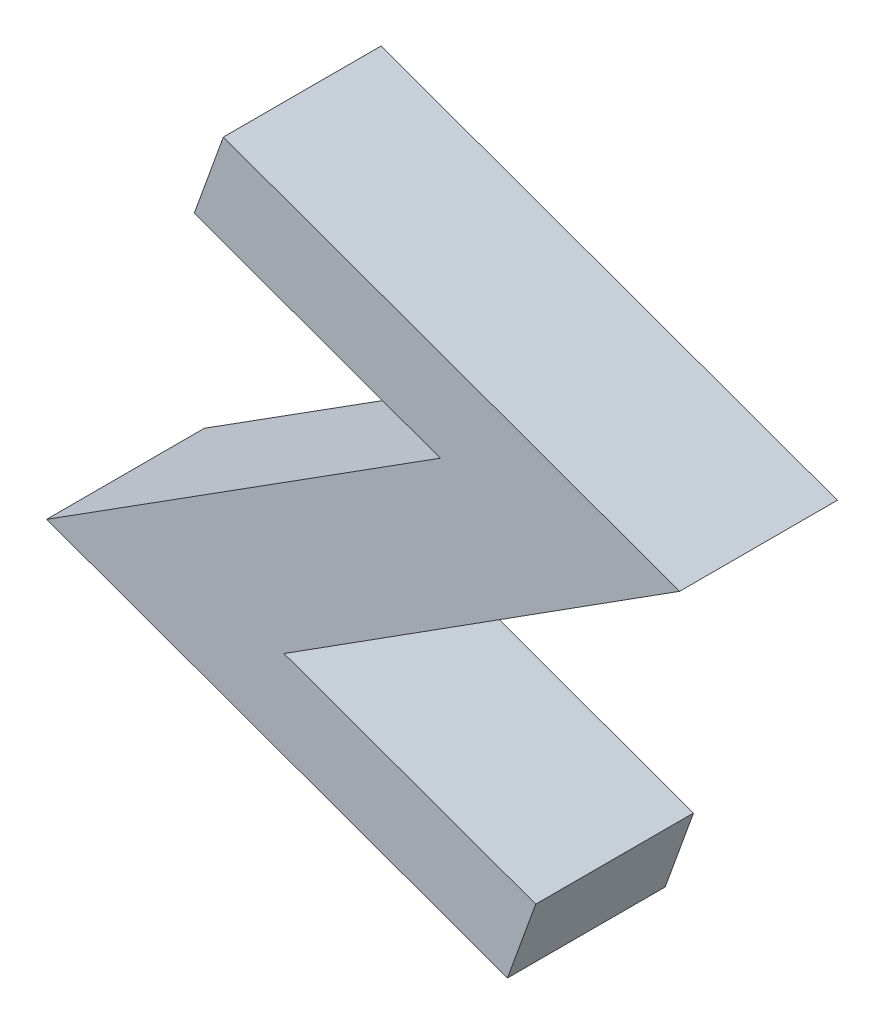
ISO-10303-21;
HEADER;
FILE_DESCRIPTION(('STEP AP214'),'2;1');
FILE_NAME('part.step','',(''),(''),'','','');
FILE_SCHEMA(('AUTOMOTIVE_DESIGN { 1 0 10303 214 1 1 1 1 }'));
ENDSEC;
DATA;
#1=APPLICATION_CONTEXT('core data for automotive mechanical design processes');
#2=APPLICATION_PROTOCOL_DEFINITION('international standard','automotive_design',2000,#1);
#3=PRODUCT_CONTEXT('',#1,'mechanical');
#4=PRODUCT('Part','Part','',(#3));
#5=PRODUCT_RELATED_PRODUCT_CATEGORY('part','',(#4));
#6=PRODUCT_DEFINITION_FORMATION('','',#4);
#7=PRODUCT_DEFINITION_CONTEXT('part definition',#1,'design');
#8=PRODUCT_DEFINITION('design','',#6,#7);
#9=PRODUCT_DEFINITION_SHAPE('','',#8);
#10=(LENGTH_UNIT() NAMED_UNIT(*) SI_UNIT(.MILLI.,.METRE.));
#11=(NAMED_UNIT(*) PLANE_ANGLE_UNIT() SI_UNIT($,.RADIAN.));
#12=(NAMED_UNIT(*) SI_UNIT($,.STERADIAN.) SOLID_ANGLE_UNIT());
#13=UNCERTAINTY_MEASURE_WITH_UNIT(LENGTH_MEASURE(1.E-05),#10,'distance_accuracy_value','');
#14=(GEOMETRIC_REPRESENTATION_CONTEXT(3) GLOBAL_UNCERTAINTY_ASSIGNED_CONTEXT((#13)) GLOBAL_UNIT_ASSIGNED_CONTEXT((#10,
#11,#12)) REPRESENTATION_CONTEXT('',''));
#15=CARTESIAN_POINT('',(0.,0.,0.));
#16=DIRECTION('',(0.,0.,1.));
#17=DIRECTION('',(1.,0.,0.));
#18=AXIS2_PLACEMENT_3D('',#15,#16,#17);
#19=CARTESIAN_POINT('',(-8.5447433746485,9.98365795167349,6.604));
#20=DIRECTION('',(-0.940506632418163,0.339775329265452,0.));
#21=DIRECTION('',(-0.339775329265452,-0.940506632418163,0.));
#22=AXIS2_PLACEMENT_3D('',#19,#20,#21);
#23=PLANE('',#22);
#24=DIRECTION('',(0.339775329265452,0.940506632418163,0.));
#25=VECTOR('',#24,1.);
#26=CARTESIAN_POINT('',(-8.5447433746485,9.98365795167349,0.));
#27=LINE('',#26,#25);
#28=CARTESIAN_POINT('',(-8.5447433746485,9.98365795167349,0.));
#29=VERTEX_POINT('',#28);
#30=CARTESIAN_POINT('',(-7.32740563426388,13.3532793459043,0.));
#31=VERTEX_POINT('',#30);
#32=EDGE_CURVE('E132',#29,#31,#27,.T.);
#33=ORIENTED_EDGE('',*,*,#32,.F.);
#34=DIRECTION('',(0.,0.,-1.));
#35=VECTOR('',#34,1.);
#36=CARTESIAN_POINT('',(-8.5447433746485,9.98365795167349,6.604));
#37=LINE('',#36,#35);
#38=CARTESIAN_POINT('',(-8.5447433746485,9.98365795167349,6.604));
#39=VERTEX_POINT('',#38);
#40=EDGE_CURVE('E11',#39,#29,#37,.T.);
#41=ORIENTED_EDGE('',*,*,#40,.F.);
#42=DIRECTION('',(0.339775329265452,0.940506632418163,0.));
#43=VECTOR('',#42,1.);
#44=CARTESIAN_POINT('',(-8.5447433746485,9.98365795167349,6.604));
#45=LINE('',#44,#43);
#46=CARTESIAN_POINT('',(-7.32740563426388,13.3532793459043,6.604));
#47=VERTEX_POINT('',#46);
#48=EDGE_CURVE('E152',#39,#47,#45,.T.);
#49=ORIENTED_EDGE('',*,*,#48,.T.);
#50=DIRECTION('',(0.,0.,-1.));
#51=VECTOR('',#50,1.);
#52=CARTESIAN_POINT('',(-7.32740563426388,13.3532793459043,6.604));
#53=LINE('',#52,#51);
#54=EDGE_CURVE('E38',#47,#31,#53,.T.);
#55=ORIENTED_EDGE('',*,*,#54,.T.);
#56=EDGE_LOOP('',(#33,#41,#49,#55));
#57=FACE_BOUND('',#56,.T.);
#58=ADVANCED_FACE('F35',(#57),#23,.T.);
#59=CARTESIAN_POINT('',(1.75874220227458,6.2515065093658,6.604));
#60=DIRECTION('',(-0.340568474829124,-0.940219715785924,0.));
#61=DIRECTION('',(0.940219715785925,-0.340568474829124,0.));
#62=AXIS2_PLACEMENT_3D('',#59,#60,#61);
#63=PLANE('',#62);
#64=DIRECTION('',(-0.940219715785924,0.340568474829124,0.));
#65=VECTOR('',#64,1.);
#66=CARTESIAN_POINT('',(1.75874220227458,6.2515065093658,0.));
#67=LINE('',#66,#65);
#68=CARTESIAN_POINT('',(1.75874220227458,6.2515065093658,0.));
#69=VERTEX_POINT('',#68);
#70=EDGE_CURVE('E150',#69,#29,#67,.T.);
#71=ORIENTED_EDGE('',*,*,#70,.F.);
#72=DIRECTION('',(0.,0.,-1.));
#73=VECTOR('',#72,1.);
#74=CARTESIAN_POINT('',(1.75874220227458,6.2515065093658,6.604));
#75=LINE('',#74,#73);
#76=CARTESIAN_POINT('',(1.75874220227458,6.2515065093658,6.604));
#77=VERTEX_POINT('',#76);
#78=EDGE_CURVE('E44',#77,#69,#75,.T.);
#79=ORIENTED_EDGE('',*,*,#78,.F.);
#80=DIRECTION('',(-0.940219715785924,0.340568474829124,0.));
#81=VECTOR('',#80,1.);
#82=CARTESIAN_POINT('',(1.75874220227458,6.2515065093658,6.604));
#83=LINE('',#82,#81);
#84=EDGE_CURVE('E122',#77,#39,#83,.T.);
#85=ORIENTED_EDGE('',*,*,#84,.T.);
#86=ORIENTED_EDGE('',*,*,#40,.T.);
#87=EDGE_LOOP('',(#71,#79,#85,#86));
#88=FACE_BOUND('',#87,.T.);
#89=ADVANCED_FACE('F164',(#88),#63,.T.);
#90=CARTESIAN_POINT('',(-14.7268347208023,-4.20843940409574,6.604));
#91=DIRECTION('',(-0.535749408263692,0.844377031630482,0.));
#92=DIRECTION('',(-0.844377031630482,-0.535749408263692,0.));
#93=AXIS2_PLACEMENT_3D('',#90,#91,#92);
#94=PLANE('',#93);
#95=DIRECTION('',(0.844377031630482,0.535749408263692,0.));
#96=VECTOR('',#95,1.);
#97=CARTESIAN_POINT('',(-14.7268347208023,-4.20843940409574,0.));
#98=LINE('',#97,#96);
#99=CARTESIAN_POINT('',(-14.7268347208023,-4.20843940409574,0.));
#100=VERTEX_POINT('',#99);
#101=EDGE_CURVE('E109',#100,#69,#98,.T.);
#102=ORIENTED_EDGE('',*,*,#101,.F.);
#103=DIRECTION('',(0.,0.,-1.));
#104=VECTOR('',#103,1.);
#105=CARTESIAN_POINT('',(-14.7268347208023,-4.20843940409574,6.604));
#106=LINE('',#105,#104);
#107=CARTESIAN_POINT('',(-14.7268347208023,-4.20843940409574,6.604));
#108=VERTEX_POINT('',#107);
#109=EDGE_CURVE('E104',#108,#100,#106,.T.);
#110=ORIENTED_EDGE('',*,*,#109,.F.);
#111=DIRECTION('',(0.844377031630482,0.535749408263692,0.));
#112=VECTOR('',#111,1.);
#113=CARTESIAN_POINT('',(-14.7268347208023,-4.20843940409574,6.604));
#114=LINE('',#113,#112);
#115=EDGE_CURVE('E107',#108,#77,#114,.T.);
#116=ORIENTED_EDGE('',*,*,#115,.T.);
#117=ORIENTED_EDGE('',*,*,#78,.T.);
#118=EDGE_LOOP('',(#102,#110,#116,#117));
#119=FACE_BOUND('',#118,.T.);
#120=ADVANCED_FACE('F106',(#119),#94,.T.);
#121=CARTESIAN_POINT('',(4.57121215419766,-11.1919129617881,6.604));
#122=DIRECTION('',(-0.340279518927562,-0.940324331812395,0.));
#123=DIRECTION('',(0.940324331812395,-0.340279518927562,0.));
#124=AXIS2_PLACEMENT_3D('',#121,#122,#123);
#125=PLANE('',#124);
#126=DIRECTION('',(-0.940324331812395,0.340279518927562,0.));
#127=VECTOR('',#126,1.);
#128=CARTESIAN_POINT('',(4.57121215419766,-11.1919129617881,0.));
#129=LINE('',#128,#127);
#130=CARTESIAN_POINT('',(4.57121215419766,-11.1919129617881,0.));
#131=VERTEX_POINT('',#130);
#132=EDGE_CURVE('E147',#131,#100,#129,.T.);
#133=ORIENTED_EDGE('',*,*,#132,.F.);
#134=DIRECTION('',(0.,0.,-1.));
#135=VECTOR('',#134,1.);
#136=CARTESIAN_POINT('',(4.57121215419766,-11.1919129617881,6.604));
#137=LINE('',#136,#135);
#138=CARTESIAN_POINT('',(4.57121215419766,-11.1919129617881,6.604));
#139=VERTEX_POINT('',#138);
#140=EDGE_CURVE('E114',#139,#131,#137,.T.);
#141=ORIENTED_EDGE('',*,*,#140,.F.);
#142=DIRECTION('',(-0.940324331812395,0.340279518927562,0.));
#143=VECTOR('',#142,1.);
#144=CARTESIAN_POINT('',(4.57121215419766,-11.1919129617881,6.604));
#145=LINE('',#144,#143);
#146=EDGE_CURVE('E120',#139,#108,#145,.T.);
#147=ORIENTED_EDGE('',*,*,#146,.T.);
#148=ORIENTED_EDGE('',*,*,#109,.T.);
#149=EDGE_LOOP('',(#133,#141,#147,#148));
#150=FACE_BOUND('',#149,.T.);
#151=ADVANCED_FACE('F124',(#150),#125,.T.);
#152=CARTESIAN_POINT('',(5.7542049426592,-7.92151031755728,6.604));
#153=DIRECTION('',(0.940368758047498,-0.340156726948337,0.));
#154=DIRECTION('',(0.340156726948337,0.940368758047499,0.));
#155=AXIS2_PLACEMENT_3D('',#152,#153,#154);
#156=PLANE('',#155);
#157=DIRECTION('',(-0.340156726948337,-0.940368758047498,0.));
#158=VECTOR('',#157,1.);
#159=CARTESIAN_POINT('',(5.7542049426592,-7.92151031755728,0.));
#160=LINE('',#159,#158);
#161=CARTESIAN_POINT('',(5.7542049426592,-7.92151031755728,0.));
#162=VERTEX_POINT('',#161);
#163=EDGE_CURVE('E144',#162,#131,#160,.T.);
#164=ORIENTED_EDGE('',*,*,#163,.F.);
#165=DIRECTION('',(0.,0.,-1.));
#166=VECTOR('',#165,1.);
#167=CARTESIAN_POINT('',(5.7542049426592,-7.92151031755728,6.604));
#168=LINE('',#167,#166);
#169=CARTESIAN_POINT('',(5.7542049426592,-7.92151031755728,6.604));
#170=VERTEX_POINT('',#169);
#171=EDGE_CURVE('E156',#170,#162,#168,.T.);
#172=ORIENTED_EDGE('',*,*,#171,.F.);
#173=DIRECTION('',(-0.340156726948337,-0.940368758047498,0.));
#174=VECTOR('',#173,1.);
#175=CARTESIAN_POINT('',(5.7542049426592,-7.92151031755728,6.604));
#176=LINE('',#175,#174);
#177=EDGE_CURVE('E125',#170,#139,#176,.T.);
#178=ORIENTED_EDGE('',*,*,#177,.T.);
#179=ORIENTED_EDGE('',*,*,#140,.T.);
#180=EDGE_LOOP('',(#164,#172,#178,#179));
#181=FACE_BOUND('',#180,.T.);
#182=ADVANCED_FACE('F177',(#181),#156,.T.);
#183=CARTESIAN_POINT('',(-4.78587919195619,-4.10540454832651,6.604));
#184=DIRECTION('',(0.340430705144743,0.940269607609782,0.));
#185=DIRECTION('',(-0.940269607609782,0.340430705144743,0.));
#186=AXIS2_PLACEMENT_3D('',#183,#184,#185);
#187=PLANE('',#186);
#188=DIRECTION('',(0.940269607609782,-0.340430705144743,0.));
#189=VECTOR('',#188,1.);
#190=CARTESIAN_POINT('',(-4.78587919195619,-4.10540454832651,0.));
#191=LINE('',#190,#189);
#192=CARTESIAN_POINT('',(-4.78587919195619,-4.10540454832651,0.));
#193=VERTEX_POINT('',#192);
#194=EDGE_CURVE('E141',#193,#162,#191,.T.);
#195=ORIENTED_EDGE('',*,*,#194,.F.);
#196=DIRECTION('',(0.,0.,-1.));
#197=VECTOR('',#196,1.);
#198=CARTESIAN_POINT('',(-4.78587919195619,-4.10540454832651,6.604));
#199=LINE('',#198,#197);
#200=CARTESIAN_POINT('',(-4.78587919195619,-4.10540454832651,6.604));
#201=VERTEX_POINT('',#200);
#202=EDGE_CURVE('E158',#201,#193,#199,.T.);
#203=ORIENTED_EDGE('',*,*,#202,.F.);
#204=DIRECTION('',(0.940269607609782,-0.340430705144743,0.));
#205=VECTOR('',#204,1.);
#206=CARTESIAN_POINT('',(-4.78587919195619,-4.10540454832651,6.604));
#207=LINE('',#206,#205);
#208=EDGE_CURVE('E127',#201,#170,#207,.T.);
#209=ORIENTED_EDGE('',*,*,#208,.T.);
#210=ORIENTED_EDGE('',*,*,#171,.T.);
#211=EDGE_LOOP('',(#195,#203,#209,#210));
#212=FACE_BOUND('',#211,.T.);
#213=ADVANCED_FACE('F180',(#212),#187,.T.);
#214=CARTESIAN_POINT('',(11.7798359522746,6.43467958628887,6.604));
#215=DIRECTION('',(0.536812610662812,-0.843701499959184,0.));
#216=DIRECTION('',(0.843701499959184,0.536812610662812,0.));
#217=AXIS2_PLACEMENT_3D('',#214,#215,#216);
#218=PLANE('',#217);
#219=DIRECTION('',(-0.843701499959184,-0.536812610662812,0.));
#220=VECTOR('',#219,1.);
#221=CARTESIAN_POINT('',(11.7798359522746,6.43467958628887,0.));
#222=LINE('',#221,#220);
#223=CARTESIAN_POINT('',(11.7798359522746,6.43467958628887,0.));
#224=VERTEX_POINT('',#223);
#225=EDGE_CURVE('E138',#224,#193,#222,.T.);
#226=ORIENTED_EDGE('',*,*,#225,.F.);
#227=DIRECTION('',(0.,0.,-1.));
#228=VECTOR('',#227,1.);
#229=CARTESIAN_POINT('',(11.7798359522746,6.43467958628887,6.604));
#230=LINE('',#229,#228);
#231=CARTESIAN_POINT('',(11.7798359522746,6.43467958628887,6.604));
#232=VERTEX_POINT('',#231);
#233=EDGE_CURVE('E159',#232,#224,#230,.T.);
#234=ORIENTED_EDGE('',*,*,#233,.F.);
#235=DIRECTION('',(-0.843701499959184,-0.536812610662812,0.));
#236=VECTOR('',#235,1.);
#237=CARTESIAN_POINT('',(11.7798359522746,6.43467958628887,6.604));
#238=LINE('',#237,#236);
#239=EDGE_CURVE('E257',#232,#201,#238,.T.);
#240=ORIENTED_EDGE('',*,*,#239,.T.);
#241=ORIENTED_EDGE('',*,*,#202,.T.);
#242=EDGE_LOOP('',(#226,#234,#240,#241));
#243=FACE_BOUND('',#242,.T.);
#244=ADVANCED_FACE('F184',(#243),#218,.T.);
#245=CARTESIAN_POINT('',(-7.32740563426388,13.3532793459043,6.604));
#246=DIRECTION('',(0.340461120914864,0.940258594826654,0.));
#247=DIRECTION('',(-0.940258594826654,0.340461120914864,0.));
#248=AXIS2_PLACEMENT_3D('',#245,#246,#247);
#249=PLANE('',#248);
#250=DIRECTION('',(0.940258594826654,-0.340461120914864,0.));
#251=VECTOR('',#250,1.);
#252=CARTESIAN_POINT('',(-7.32740563426388,13.3532793459043,0.));
#253=LINE('',#252,#251);
#254=EDGE_CURVE('E135',#31,#224,#253,.T.);
#255=ORIENTED_EDGE('',*,*,#254,.F.);
#256=ORIENTED_EDGE('',*,*,#54,.F.);
#257=DIRECTION('',(0.940258594826654,-0.340461120914864,0.));
#258=VECTOR('',#257,1.);
#259=CARTESIAN_POINT('',(-7.32740563426388,13.3532793459043,6.604));
#260=LINE('',#259,#258);
#261=EDGE_CURVE('E258',#47,#232,#260,.T.);
#262=ORIENTED_EDGE('',*,*,#261,.T.);
#263=ORIENTED_EDGE('',*,*,#233,.T.);
#264=EDGE_LOOP('',(#255,#256,#262,#263));
#265=FACE_BOUND('',#264,.T.);
#266=ADVANCED_FACE('F161',(#265),#249,.T.);
#267=CARTESIAN_POINT('',(0.,0.,6.604));
#268=DIRECTION('',(0.,0.,1.));
#269=DIRECTION('',(1.,0.,0.));
#270=AXIS2_PLACEMENT_3D('',#267,#268,#269);
#271=PLANE('',#270);
#272=ORIENTED_EDGE('',*,*,#48,.F.);
#273=ORIENTED_EDGE('',*,*,#84,.F.);
#274=ORIENTED_EDGE('',*,*,#115,.F.);
#275=ORIENTED_EDGE('',*,*,#146,.F.);
#276=ORIENTED_EDGE('',*,*,#177,.F.);
#277=ORIENTED_EDGE('',*,*,#208,.F.);
#278=ORIENTED_EDGE('',*,*,#239,.F.);
#279=ORIENTED_EDGE('',*,*,#261,.F.);
#280=EDGE_LOOP('',(#272,#273,#274,#275,#276,#277,#278,#279));
#281=FACE_BOUND('',#280,.T.);
#282=ADVANCED_FACE('F118',(#281),#271,.T.);
#283=CARTESIAN_POINT('',(0.,0.,0.));
#284=DIRECTION('',(0.,0.,1.));
#285=DIRECTION('',(1.,0.,0.));
#286=AXIS2_PLACEMENT_3D('',#283,#284,#285);
#287=PLANE('',#286);
#288=ORIENTED_EDGE('',*,*,#32,.T.);
#289=ORIENTED_EDGE('',*,*,#254,.T.);
#290=ORIENTED_EDGE('',*,*,#225,.T.);
#291=ORIENTED_EDGE('',*,*,#194,.T.);
#292=ORIENTED_EDGE('',*,*,#163,.T.);
#293=ORIENTED_EDGE('',*,*,#132,.T.);
#294=ORIENTED_EDGE('',*,*,#101,.T.);
#295=ORIENTED_EDGE('',*,*,#70,.T.);
#296=EDGE_LOOP('',(#288,#289,#290,#291,#292,#293,#294,#295));
#297=FACE_BOUND('',#296,.T.);
#298=ADVANCED_FACE('F163',(#297),#287,.F.);
#299=CLOSED_SHELL('',(#58,#89,#120,#151,#182,#213,#244,#266,#282,#298));
#300=MANIFOLD_SOLID_BREP('B2',#299);
#301=ADVANCED_BREP_SHAPE_REPRESENTATION('',(#18,#300),#14);
#302=SHAPE_DEFINITION_REPRESENTATION(#9,#301);
ENDSEC;
END-ISO-10303-21;
